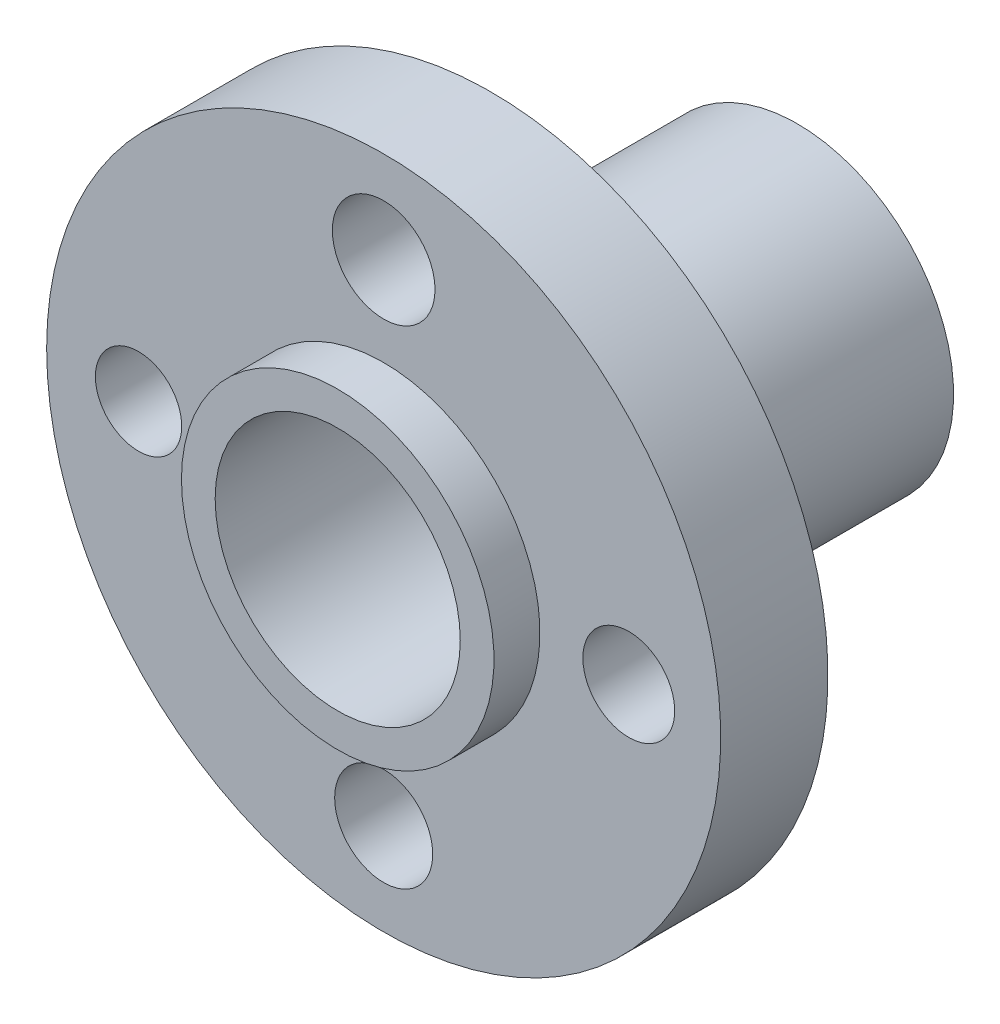
ISO-10303-21;
HEADER;
FILE_DESCRIPTION(('STEP AP214'),'2;1');
FILE_NAME('part.step','',(''),(''),'','','');
FILE_SCHEMA(('AUTOMOTIVE_DESIGN { 1 0 10303 214 1 1 1 1 }'));
ENDSEC;
DATA;
#1=APPLICATION_CONTEXT('core data for automotive mechanical design processes');
#2=APPLICATION_PROTOCOL_DEFINITION('international standard','automotive_design',2000,#1);
#3=PRODUCT_CONTEXT('',#1,'mechanical');
#4=PRODUCT('Part','Part','',(#3));
#5=PRODUCT_RELATED_PRODUCT_CATEGORY('part','',(#4));
#6=PRODUCT_DEFINITION_FORMATION('','',#4);
#7=PRODUCT_DEFINITION_CONTEXT('part definition',#1,'design');
#8=PRODUCT_DEFINITION('design','',#6,#7);
#9=PRODUCT_DEFINITION_SHAPE('','',#8);
#10=(LENGTH_UNIT() NAMED_UNIT(*) SI_UNIT(.MILLI.,.METRE.));
#11=(NAMED_UNIT(*) PLANE_ANGLE_UNIT() SI_UNIT($,.RADIAN.));
#12=(NAMED_UNIT(*) SI_UNIT($,.STERADIAN.) SOLID_ANGLE_UNIT());
#13=UNCERTAINTY_MEASURE_WITH_UNIT(LENGTH_MEASURE(1.E-05),#10,'distance_accuracy_value','');
#14=(GEOMETRIC_REPRESENTATION_CONTEXT(3) GLOBAL_UNCERTAINTY_ASSIGNED_CONTEXT((#13)) GLOBAL_UNIT_ASSIGNED_CONTEXT((#10,
#11,#12)) REPRESENTATION_CONTEXT('',''));
#15=CARTESIAN_POINT('',(0.,0.,0.));
#16=DIRECTION('',(0.,0.,1.));
#17=DIRECTION('',(1.,0.,0.));
#18=AXIS2_PLACEMENT_3D('',#15,#16,#17);
#19=CARTESIAN_POINT('',(0.,0.,0.));
#20=DIRECTION('',(0.,0.,-1.));
#21=DIRECTION('',(-1.,0.,0.));
#22=AXIS2_PLACEMENT_3D('',#19,#20,#21);
#23=PLANE('',#22);
#24=CARTESIAN_POINT('',(0.,0.,0.));
#25=DIRECTION('',(0.,0.,-1.));
#26=DIRECTION('',(-1.,0.,0.));
#27=AXIS2_PLACEMENT_3D('',#24,#25,#26);
#28=CIRCLE('',#27,4.);
#29=CARTESIAN_POINT('',(-4.,0.,0.));
#30=VERTEX_POINT('',#29);
#31=EDGE_CURVE('E55',#30,#30,#28,.T.);
#32=ORIENTED_EDGE('',*,*,#31,.T.);
#33=EDGE_LOOP('',(#32));
#34=FACE_BOUND('',#33,.T.);
#35=CARTESIAN_POINT('',(0.,0.,0.));
#36=DIRECTION('',(0.,0.,-1.));
#37=DIRECTION('',(-1.,0.,0.));
#38=AXIS2_PLACEMENT_3D('',#35,#36,#37);
#39=CIRCLE('',#38,5.1);
#40=CARTESIAN_POINT('',(-5.1,0.,0.));
#41=VERTEX_POINT('',#40);
#42=EDGE_CURVE('E10',#41,#41,#39,.T.);
#43=ORIENTED_EDGE('',*,*,#42,.F.);
#44=EDGE_LOOP('',(#43));
#45=FACE_BOUND('',#44,.T.);
#46=ADVANCED_FACE('F30',(#34,#45),#23,.F.);
#47=CARTESIAN_POINT('',(0.,0.,-15.));
#48=DIRECTION('',(0.,0.,-1.));
#49=DIRECTION('',(-1.,0.,0.));
#50=AXIS2_PLACEMENT_3D('',#47,#48,#49);
#51=CYLINDRICAL_SURFACE('',#50,5.1);
#52=CARTESIAN_POINT('',(0.,0.,-1.5));
#53=DIRECTION('',(0.,0.,-1.));
#54=DIRECTION('',(-1.,0.,0.));
#55=AXIS2_PLACEMENT_3D('',#52,#53,#54);
#56=CIRCLE('',#55,5.1);
#57=CARTESIAN_POINT('',(-5.1,0.,-1.5));
#58=VERTEX_POINT('',#57);
#59=EDGE_CURVE('E36',#58,#58,#56,.T.);
#60=ORIENTED_EDGE('',*,*,#59,.F.);
#61=EDGE_LOOP('',(#60));
#62=FACE_BOUND('',#61,.T.);
#63=ORIENTED_EDGE('',*,*,#42,.T.);
#64=EDGE_LOOP('',(#63));
#65=FACE_BOUND('',#64,.T.);
#66=ADVANCED_FACE('F112',(#62,#65),#51,.T.);
#67=CARTESIAN_POINT('',(5.1,0.,-1.5));
#68=DIRECTION('',(0.,0.,-1.));
#69=DIRECTION('',(-1.,0.,0.));
#70=AXIS2_PLACEMENT_3D('',#67,#68,#69);
#71=PLANE('',#70);
#72=CARTESIAN_POINT('',(-8.,0.,-1.5));
#73=DIRECTION('',(0.,0.,-1.));
#74=DIRECTION('',(-1.,0.,0.));
#75=AXIS2_PLACEMENT_3D('',#72,#73,#74);
#76=CIRCLE('',#75,1.40913703626274);
#77=CARTESIAN_POINT('',(-9.40913703626274,0.,-1.5));
#78=VERTEX_POINT('',#77);
#79=EDGE_CURVE('E59',#78,#78,#76,.T.);
#80=ORIENTED_EDGE('',*,*,#79,.T.);
#81=EDGE_LOOP('',(#80));
#82=FACE_BOUND('',#81,.T.);
#83=CARTESIAN_POINT('',(0.,-8.,-1.5));
#84=DIRECTION('',(0.,0.,-1.));
#85=DIRECTION('',(-1.,0.,0.));
#86=AXIS2_PLACEMENT_3D('',#83,#84,#85);
#87=CIRCLE('',#86,1.6);
#88=CARTESIAN_POINT('',(-1.6,-8.,-1.5));
#89=VERTEX_POINT('',#88);
#90=EDGE_CURVE('E64',#89,#89,#87,.T.);
#91=ORIENTED_EDGE('',*,*,#90,.T.);
#92=EDGE_LOOP('',(#91));
#93=FACE_BOUND('',#92,.T.);
#94=CARTESIAN_POINT('',(8.,0.,-1.5));
#95=DIRECTION('',(0.,0.,-1.));
#96=DIRECTION('',(-1.,0.,0.));
#97=AXIS2_PLACEMENT_3D('',#94,#95,#96);
#98=CIRCLE('',#97,1.49849823961308);
#99=CARTESIAN_POINT('',(6.50150176038692,0.,-1.5));
#100=VERTEX_POINT('',#99);
#101=EDGE_CURVE('E67',#100,#100,#98,.T.);
#102=ORIENTED_EDGE('',*,*,#101,.T.);
#103=EDGE_LOOP('',(#102));
#104=FACE_BOUND('',#103,.T.);
#105=CARTESIAN_POINT('',(0.,8.,-1.5));
#106=DIRECTION('',(0.,0.,-1.));
#107=DIRECTION('',(-1.,0.,0.));
#108=AXIS2_PLACEMENT_3D('',#105,#106,#107);
#109=CIRCLE('',#108,1.6743128846827);
#110=CARTESIAN_POINT('',(-1.6743128846827,8.,-1.5));
#111=VERTEX_POINT('',#110);
#112=EDGE_CURVE('E70',#111,#111,#109,.T.);
#113=ORIENTED_EDGE('',*,*,#112,.T.);
#114=EDGE_LOOP('',(#113));
#115=FACE_BOUND('',#114,.T.);
#116=CARTESIAN_POINT('',(0.,0.,-1.5));
#117=DIRECTION('',(0.,0.,-1.));
#118=DIRECTION('',(-1.,0.,0.));
#119=AXIS2_PLACEMENT_3D('',#116,#117,#118);
#120=CIRCLE('',#119,11.);
#121=CARTESIAN_POINT('',(-11.,0.,-1.5));
#122=VERTEX_POINT('',#121);
#123=EDGE_CURVE('E40',#122,#122,#120,.T.);
#124=ORIENTED_EDGE('',*,*,#123,.F.);
#125=EDGE_LOOP('',(#124));
#126=FACE_BOUND('',#125,.T.);
#127=ORIENTED_EDGE('',*,*,#59,.T.);
#128=EDGE_LOOP('',(#127));
#129=FACE_BOUND('',#128,.T.);
#130=ADVANCED_FACE('F107',(#82,#93,#104,#115,#126,#129),#71,.F.);
#131=CARTESIAN_POINT('',(0.,0.,-15.));
#132=DIRECTION('',(0.,0.,-1.));
#133=DIRECTION('',(-1.,0.,0.));
#134=AXIS2_PLACEMENT_3D('',#131,#132,#133);
#135=CYLINDRICAL_SURFACE('',#134,11.);
#136=CARTESIAN_POINT('',(0.,0.,-5.));
#137=DIRECTION('',(0.,0.,-1.));
#138=DIRECTION('',(-1.,0.,0.));
#139=AXIS2_PLACEMENT_3D('',#136,#137,#138);
#140=CIRCLE('',#139,11.);
#141=CARTESIAN_POINT('',(-11.,0.,-5.));
#142=VERTEX_POINT('',#141);
#143=EDGE_CURVE('E44',#142,#142,#140,.T.);
#144=ORIENTED_EDGE('',*,*,#143,.F.);
#145=EDGE_LOOP('',(#144));
#146=FACE_BOUND('',#145,.T.);
#147=ORIENTED_EDGE('',*,*,#123,.T.);
#148=EDGE_LOOP('',(#147));
#149=FACE_BOUND('',#148,.T.);
#150=ADVANCED_FACE('F93',(#146,#149),#135,.T.);
#151=CARTESIAN_POINT('',(11.,0.,-5.));
#152=DIRECTION('',(0.,0.,1.));
#153=DIRECTION('',(1.,0.,0.));
#154=AXIS2_PLACEMENT_3D('',#151,#152,#153);
#155=PLANE('',#154);
#156=CARTESIAN_POINT('',(-8.,0.,-5.));
#157=DIRECTION('',(0.,0.,-1.));
#158=DIRECTION('',(-1.,0.,0.));
#159=AXIS2_PLACEMENT_3D('',#156,#157,#158);
#160=CIRCLE('',#159,1.40913703626274);
#161=CARTESIAN_POINT('',(-9.40913703626274,0.,-5.));
#162=VERTEX_POINT('',#161);
#163=EDGE_CURVE('E73',#162,#162,#160,.T.);
#164=ORIENTED_EDGE('',*,*,#163,.F.);
#165=EDGE_LOOP('',(#164));
#166=FACE_BOUND('',#165,.T.);
#167=CARTESIAN_POINT('',(0.,-8.,-5.));
#168=DIRECTION('',(0.,0.,-1.));
#169=DIRECTION('',(-1.,0.,0.));
#170=AXIS2_PLACEMENT_3D('',#167,#168,#169);
#171=CIRCLE('',#170,1.6);
#172=CARTESIAN_POINT('',(-1.6,-8.,-5.));
#173=VERTEX_POINT('',#172);
#174=EDGE_CURVE('E80',#173,#173,#171,.T.);
#175=ORIENTED_EDGE('',*,*,#174,.F.);
#176=EDGE_LOOP('',(#175));
#177=FACE_BOUND('',#176,.T.);
#178=CARTESIAN_POINT('',(8.,0.,-5.));
#179=DIRECTION('',(0.,0.,-1.));
#180=DIRECTION('',(-1.,0.,0.));
#181=AXIS2_PLACEMENT_3D('',#178,#179,#180);
#182=CIRCLE('',#181,1.49849823961308);
#183=CARTESIAN_POINT('',(6.50150176038692,0.,-5.));
#184=VERTEX_POINT('',#183);
#185=EDGE_CURVE('E77',#184,#184,#182,.T.);
#186=ORIENTED_EDGE('',*,*,#185,.F.);
#187=EDGE_LOOP('',(#186));
#188=FACE_BOUND('',#187,.T.);
#189=CARTESIAN_POINT('',(0.,8.,-5.));
#190=DIRECTION('',(0.,0.,-1.));
#191=DIRECTION('',(-1.,0.,0.));
#192=AXIS2_PLACEMENT_3D('',#189,#190,#191);
#193=CIRCLE('',#192,1.6743128846827);
#194=CARTESIAN_POINT('',(-1.6743128846827,8.,-5.));
#195=VERTEX_POINT('',#194);
#196=EDGE_CURVE('E74',#195,#195,#193,.T.);
#197=ORIENTED_EDGE('',*,*,#196,.F.);
#198=EDGE_LOOP('',(#197));
#199=FACE_BOUND('',#198,.T.);
#200=CARTESIAN_POINT('',(0.,0.,-5.));
#201=DIRECTION('',(0.,0.,-1.));
#202=DIRECTION('',(-1.,0.,0.));
#203=AXIS2_PLACEMENT_3D('',#200,#201,#202);
#204=CIRCLE('',#203,5.1);
#205=CARTESIAN_POINT('',(-5.1,0.,-5.));
#206=VERTEX_POINT('',#205);
#207=EDGE_CURVE('E49',#206,#206,#204,.T.);
#208=ORIENTED_EDGE('',*,*,#207,.F.);
#209=EDGE_LOOP('',(#208));
#210=FACE_BOUND('',#209,.T.);
#211=ORIENTED_EDGE('',*,*,#143,.T.);
#212=EDGE_LOOP('',(#211));
#213=FACE_BOUND('',#212,.T.);
#214=ADVANCED_FACE('F89',(#166,#177,#188,#199,#210,#213),#155,.F.);
#215=CARTESIAN_POINT('',(0.,0.,-15.));
#216=DIRECTION('',(0.,0.,-1.));
#217=DIRECTION('',(-1.,0.,0.));
#218=AXIS2_PLACEMENT_3D('',#215,#216,#217);
#219=CYLINDRICAL_SURFACE('',#218,5.1);
#220=CARTESIAN_POINT('',(0.,0.,-15.));
#221=DIRECTION('',(0.,0.,-1.));
#222=DIRECTION('',(-1.,0.,0.));
#223=AXIS2_PLACEMENT_3D('',#220,#221,#222);
#224=CIRCLE('',#223,5.1);
#225=CARTESIAN_POINT('',(-5.1,0.,-15.));
#226=VERTEX_POINT('',#225);
#227=EDGE_CURVE('E52',#226,#226,#224,.T.);
#228=ORIENTED_EDGE('',*,*,#227,.F.);
#229=EDGE_LOOP('',(#228));
#230=FACE_BOUND('',#229,.T.);
#231=ORIENTED_EDGE('',*,*,#207,.T.);
#232=EDGE_LOOP('',(#231));
#233=FACE_BOUND('',#232,.T.);
#234=ADVANCED_FACE('F92',(#230,#233),#219,.T.);
#235=CARTESIAN_POINT('',(5.1,0.,-15.));
#236=DIRECTION('',(0.,0.,1.));
#237=DIRECTION('',(1.,0.,0.));
#238=AXIS2_PLACEMENT_3D('',#235,#236,#237);
#239=PLANE('',#238);
#240=CARTESIAN_POINT('',(0.,0.,-15.));
#241=DIRECTION('',(0.,0.,-1.));
#242=DIRECTION('',(-1.,0.,0.));
#243=AXIS2_PLACEMENT_3D('',#240,#241,#242);
#244=CIRCLE('',#243,4.);
#245=CARTESIAN_POINT('',(-4.,0.,-15.));
#246=VERTEX_POINT('',#245);
#247=EDGE_CURVE('E56',#246,#246,#244,.T.);
#248=ORIENTED_EDGE('',*,*,#247,.F.);
#249=EDGE_LOOP('',(#248));
#250=FACE_BOUND('',#249,.T.);
#251=ORIENTED_EDGE('',*,*,#227,.T.);
#252=EDGE_LOOP('',(#251));
#253=FACE_BOUND('',#252,.T.);
#254=ADVANCED_FACE('F131',(#250,#253),#239,.F.);
#255=CARTESIAN_POINT('',(0.,0.,0.));
#256=DIRECTION('',(0.,0.,-1.));
#257=DIRECTION('',(-1.,0.,0.));
#258=AXIS2_PLACEMENT_3D('',#255,#256,#257);
#259=CYLINDRICAL_SURFACE('',#258,4.);
#260=ORIENTED_EDGE('',*,*,#31,.F.);
#261=EDGE_LOOP('',(#260));
#262=FACE_BOUND('',#261,.T.);
#263=ORIENTED_EDGE('',*,*,#247,.T.);
#264=EDGE_LOOP('',(#263));
#265=FACE_BOUND('',#264,.T.);
#266=ADVANCED_FACE('F127',(#262,#265),#259,.F.);
#267=CARTESIAN_POINT('',(0.,8.,0.));
#268=DIRECTION('',(0.,0.,-1.));
#269=DIRECTION('',(-1.,0.,0.));
#270=AXIS2_PLACEMENT_3D('',#267,#268,#269);
#271=CYLINDRICAL_SURFACE('',#270,1.6743128846827);
#272=ORIENTED_EDGE('',*,*,#196,.T.);
#273=EDGE_LOOP('',(#272));
#274=FACE_BOUND('',#273,.T.);
#275=ORIENTED_EDGE('',*,*,#112,.F.);
#276=EDGE_LOOP('',(#275));
#277=FACE_BOUND('',#276,.T.);
#278=ADVANCED_FACE('F130',(#274,#277),#271,.F.);
#279=CARTESIAN_POINT('',(8.,0.,0.));
#280=DIRECTION('',(0.,0.,-1.));
#281=DIRECTION('',(-1.,0.,0.));
#282=AXIS2_PLACEMENT_3D('',#279,#280,#281);
#283=CYLINDRICAL_SURFACE('',#282,1.49849823961308);
#284=ORIENTED_EDGE('',*,*,#185,.T.);
#285=EDGE_LOOP('',(#284));
#286=FACE_BOUND('',#285,.T.);
#287=ORIENTED_EDGE('',*,*,#101,.F.);
#288=EDGE_LOOP('',(#287));
#289=FACE_BOUND('',#288,.T.);
#290=ADVANCED_FACE('F148',(#286,#289),#283,.F.);
#291=CARTESIAN_POINT('',(0.,-8.,0.));
#292=DIRECTION('',(0.,0.,-1.));
#293=DIRECTION('',(-1.,0.,0.));
#294=AXIS2_PLACEMENT_3D('',#291,#292,#293);
#295=CYLINDRICAL_SURFACE('',#294,1.6);
#296=ORIENTED_EDGE('',*,*,#174,.T.);
#297=EDGE_LOOP('',(#296));
#298=FACE_BOUND('',#297,.T.);
#299=ORIENTED_EDGE('',*,*,#90,.F.);
#300=EDGE_LOOP('',(#299));
#301=FACE_BOUND('',#300,.T.);
#302=ADVANCED_FACE('F152',(#298,#301),#295,.F.);
#303=CARTESIAN_POINT('',(-8.,0.,0.));
#304=DIRECTION('',(0.,0.,-1.));
#305=DIRECTION('',(-1.,0.,0.));
#306=AXIS2_PLACEMENT_3D('',#303,#304,#305);
#307=CYLINDRICAL_SURFACE('',#306,1.40913703626274);
#308=ORIENTED_EDGE('',*,*,#163,.T.);
#309=EDGE_LOOP('',(#308));
#310=FACE_BOUND('',#309,.T.);
#311=ORIENTED_EDGE('',*,*,#79,.F.);
#312=EDGE_LOOP('',(#311));
#313=FACE_BOUND('',#312,.T.);
#314=ADVANCED_FACE('F86',(#310,#313),#307,.F.);
#315=CLOSED_SHELL('',(#46,#66,#130,#150,#214,#234,#254,#266,#278,#290,#302,#314));
#316=MANIFOLD_SOLID_BREP('B2',#315);
#317=ADVANCED_BREP_SHAPE_REPRESENTATION('',(#18,#316),#14);
#318=SHAPE_DEFINITION_REPRESENTATION(#9,#317);
ENDSEC;
END-ISO-10303-21;
